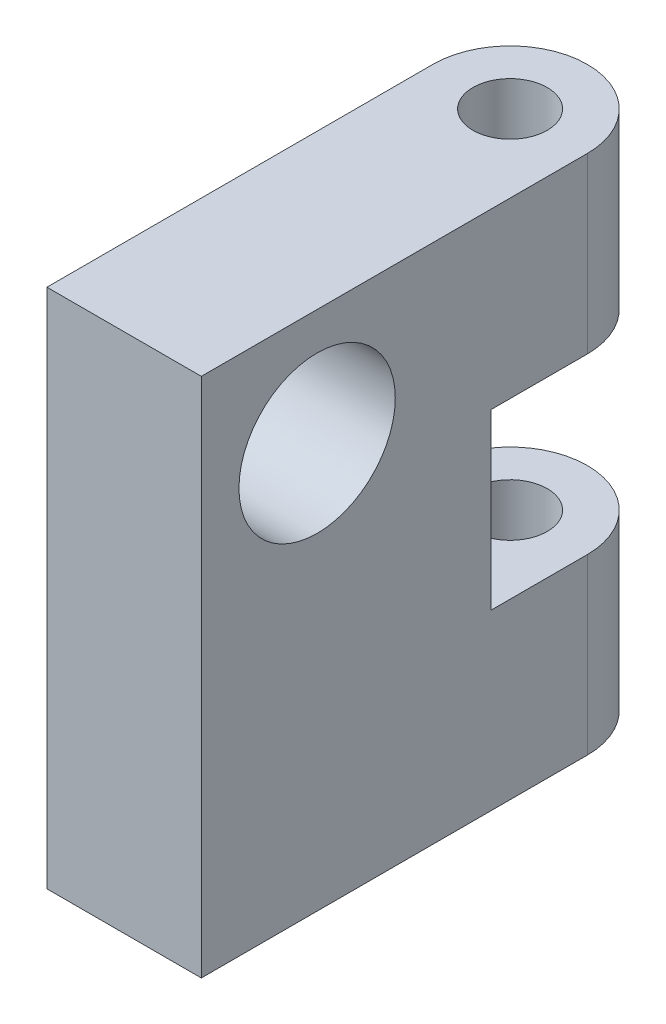
ISO-10303-21;
HEADER;
FILE_DESCRIPTION(('STEP AP214'),'2;1');
FILE_NAME('part.step','',(''),(''),'','','');
FILE_SCHEMA(('AUTOMOTIVE_DESIGN { 1 0 10303 214 1 1 1 1 }'));
ENDSEC;
DATA;
#1=APPLICATION_CONTEXT('core data for automotive mechanical design processes');
#2=APPLICATION_PROTOCOL_DEFINITION('international standard','automotive_design',2000,#1);
#3=PRODUCT_CONTEXT('',#1,'mechanical');
#4=PRODUCT('Part','Part','',(#3));
#5=PRODUCT_RELATED_PRODUCT_CATEGORY('part','',(#4));
#6=PRODUCT_DEFINITION_FORMATION('','',#4);
#7=PRODUCT_DEFINITION_CONTEXT('part definition',#1,'design');
#8=PRODUCT_DEFINITION('design','',#6,#7);
#9=PRODUCT_DEFINITION_SHAPE('','',#8);
#10=(LENGTH_UNIT() NAMED_UNIT(*) SI_UNIT(.MILLI.,.METRE.));
#11=(NAMED_UNIT(*) PLANE_ANGLE_UNIT() SI_UNIT($,.RADIAN.));
#12=(NAMED_UNIT(*) SI_UNIT($,.STERADIAN.) SOLID_ANGLE_UNIT());
#13=UNCERTAINTY_MEASURE_WITH_UNIT(LENGTH_MEASURE(1.E-05),#10,'distance_accuracy_value','');
#14=(GEOMETRIC_REPRESENTATION_CONTEXT(3) GLOBAL_UNCERTAINTY_ASSIGNED_CONTEXT((#13)) GLOBAL_UNIT_ASSIGNED_CONTEXT((#10,
#11,#12)) REPRESENTATION_CONTEXT('',''));
#15=CARTESIAN_POINT('',(0.,0.,0.));
#16=DIRECTION('',(0.,0.,1.));
#17=DIRECTION('',(1.,0.,0.));
#18=AXIS2_PLACEMENT_3D('',#15,#16,#17);
#19=CARTESIAN_POINT('',(0.,27.,0.));
#20=DIRECTION('',(0.,-1.,0.));
#21=DIRECTION('',(0.,0.,-1.));
#22=AXIS2_PLACEMENT_3D('',#19,#20,#21);
#23=CYLINDRICAL_SURFACE('',#22,4.);
#24=CARTESIAN_POINT('',(0.,9.,0.));
#25=DIRECTION('',(0.,-1.,0.));
#26=DIRECTION('',(0.,0.,-1.));
#27=AXIS2_PLACEMENT_3D('',#24,#25,#26);
#28=CIRCLE('',#27,4.);
#29=CARTESIAN_POINT('',(-4.,9.,0.));
#30=VERTEX_POINT('',#29);
#31=CARTESIAN_POINT('',(4.,9.,0.));
#32=VERTEX_POINT('',#31);
#33=EDGE_CURVE('E124',#30,#32,#28,.T.);
#34=ORIENTED_EDGE('',*,*,#33,.T.);
#35=DIRECTION('',(0.,-1.,0.));
#36=VECTOR('',#35,1.);
#37=CARTESIAN_POINT('',(4.,27.,0.));
#38=LINE('',#37,#36);
#39=CARTESIAN_POINT('',(4.,0.,0.));
#40=VERTEX_POINT('',#39);
#41=EDGE_CURVE('E44',#32,#40,#38,.T.);
#42=ORIENTED_EDGE('',*,*,#41,.T.);
#43=CARTESIAN_POINT('',(0.,0.,0.));
#44=DIRECTION('',(0.,1.,0.));
#45=DIRECTION('',(0.,0.,1.));
#46=AXIS2_PLACEMENT_3D('',#43,#44,#45);
#47=CIRCLE('',#46,4.);
#48=CARTESIAN_POINT('',(-4.,0.,0.));
#49=VERTEX_POINT('',#48);
#50=EDGE_CURVE('E168',#40,#49,#47,.T.);
#51=ORIENTED_EDGE('',*,*,#50,.T.);
#52=DIRECTION('',(0.,-1.,0.));
#53=VECTOR('',#52,1.);
#54=CARTESIAN_POINT('',(-4.,27.,0.));
#55=LINE('',#54,#53);
#56=EDGE_CURVE('E181',#30,#49,#55,.T.);
#57=ORIENTED_EDGE('',*,*,#56,.F.);
#58=EDGE_LOOP('',(#34,#42,#51,#57));
#59=FACE_BOUND('',#58,.T.);
#60=ADVANCED_FACE('F35',(#59),#23,.T.);
#61=CARTESIAN_POINT('',(0.,27.,0.));
#62=DIRECTION('',(0.,-1.,0.));
#63=DIRECTION('',(0.,0.,-1.));
#64=AXIS2_PLACEMENT_3D('',#61,#62,#63);
#65=CYLINDRICAL_SURFACE('',#64,1.925);
#66=CARTESIAN_POINT('',(0.,9.,0.));
#67=DIRECTION('',(0.,-1.,0.));
#68=DIRECTION('',(0.,0.,-1.));
#69=AXIS2_PLACEMENT_3D('',#66,#67,#68);
#70=CIRCLE('',#69,1.925);
#71=CARTESIAN_POINT('',(0.,9.,-1.925));
#72=VERTEX_POINT('',#71);
#73=EDGE_CURVE('E39',#72,#72,#70,.T.);
#74=ORIENTED_EDGE('',*,*,#73,.F.);
#75=EDGE_LOOP('',(#74));
#76=FACE_BOUND('',#75,.T.);
#77=CARTESIAN_POINT('',(0.,0.,0.));
#78=DIRECTION('',(0.,1.,0.));
#79=DIRECTION('',(0.,0.,1.));
#80=AXIS2_PLACEMENT_3D('',#77,#78,#79);
#81=CIRCLE('',#80,1.925);
#82=CARTESIAN_POINT('',(0.,0.,1.925));
#83=VERTEX_POINT('',#82);
#84=EDGE_CURVE('E157',#83,#83,#81,.T.);
#85=ORIENTED_EDGE('',*,*,#84,.F.);
#86=EDGE_LOOP('',(#85));
#87=FACE_BOUND('',#86,.T.);
#88=ADVANCED_FACE('F196',(#76,#87),#65,.F.);
#89=CARTESIAN_POINT('',(4.,27.,0.));
#90=DIRECTION('',(1.,0.,0.));
#91=DIRECTION('',(0.,0.,-1.));
#92=AXIS2_PLACEMENT_3D('',#89,#90,#91);
#93=PLANE('',#92);
#94=DIRECTION('',(0.,0.,-1.));
#95=VECTOR('',#94,1.);
#96=CARTESIAN_POINT('',(4.,9.,0.));
#97=LINE('',#96,#95);
#98=CARTESIAN_POINT('',(4.,9.,5.));
#99=VERTEX_POINT('',#98);
#100=EDGE_CURVE('E147',#99,#32,#97,.T.);
#101=ORIENTED_EDGE('',*,*,#100,.F.);
#102=DIRECTION('',(0.,-1.,0.));
#103=VECTOR('',#102,1.);
#104=CARTESIAN_POINT('',(4.,27.,5.));
#105=LINE('',#104,#103);
#106=CARTESIAN_POINT('',(4.,18.,5.));
#107=VERTEX_POINT('',#106);
#108=EDGE_CURVE('E113',#107,#99,#105,.T.);
#109=ORIENTED_EDGE('',*,*,#108,.F.);
#110=DIRECTION('',(0.,0.,1.));
#111=VECTOR('',#110,1.);
#112=CARTESIAN_POINT('',(4.,18.,0.));
#113=LINE('',#112,#111);
#114=CARTESIAN_POINT('',(4.,18.,0.));
#115=VERTEX_POINT('',#114);
#116=EDGE_CURVE('E144',#115,#107,#113,.T.);
#117=ORIENTED_EDGE('',*,*,#116,.F.);
#118=CARTESIAN_POINT('',(4.,27.,0.));
#119=VERTEX_POINT('',#118);
#120=EDGE_CURVE('E11',#119,#115,#38,.T.);
#121=ORIENTED_EDGE('',*,*,#120,.F.);
#122=DIRECTION('',(0.,0.,1.));
#123=VECTOR('',#122,1.);
#124=CARTESIAN_POINT('',(4.,27.,0.));
#125=LINE('',#124,#123);
#126=CARTESIAN_POINT('',(4.,27.,20.));
#127=VERTEX_POINT('',#126);
#128=EDGE_CURVE('E154',#119,#127,#125,.T.);
#129=ORIENTED_EDGE('',*,*,#128,.T.);
#130=DIRECTION('',(0.,-1.,0.));
#131=VECTOR('',#130,1.);
#132=CARTESIAN_POINT('',(4.,27.,20.));
#133=LINE('',#132,#131);
#134=CARTESIAN_POINT('',(4.,0.,20.));
#135=VERTEX_POINT('',#134);
#136=EDGE_CURVE('E82',#127,#135,#133,.T.);
#137=ORIENTED_EDGE('',*,*,#136,.T.);
#138=DIRECTION('',(0.,0.,1.));
#139=VECTOR('',#138,1.);
#140=CARTESIAN_POINT('',(4.,0.,0.));
#141=LINE('',#140,#139);
#142=EDGE_CURVE('E165',#40,#135,#141,.T.);
#143=ORIENTED_EDGE('',*,*,#142,.F.);
#144=ORIENTED_EDGE('',*,*,#41,.F.);
#145=EDGE_LOOP('',(#101,#109,#117,#121,#129,#137,#143,#144));
#146=FACE_BOUND('',#145,.T.);
#147=CARTESIAN_POINT('',(4.,21.,14.));
#148=DIRECTION('',(1.,0.,0.));
#149=DIRECTION('',(0.,0.,-1.));
#150=AXIS2_PLACEMENT_3D('',#147,#148,#149);
#151=CIRCLE('',#150,4.05);
#152=CARTESIAN_POINT('',(4.,21.,9.95));
#153=VERTEX_POINT('',#152);
#154=EDGE_CURVE('E150',#153,#153,#151,.T.);
#155=ORIENTED_EDGE('',*,*,#154,.F.);
#156=EDGE_LOOP('',(#155));
#157=FACE_BOUND('',#156,.T.);
#158=ADVANCED_FACE('F37',(#146,#157),#93,.T.);
#159=CARTESIAN_POINT('',(0.,18.,0.));
#160=DIRECTION('',(0.,1.,0.));
#161=DIRECTION('',(0.,0.,1.));
#162=AXIS2_PLACEMENT_3D('',#159,#160,#161);
#163=CIRCLE('',#162,4.);
#164=CARTESIAN_POINT('',(-4.,18.,0.));
#165=VERTEX_POINT('',#164);
#166=EDGE_CURVE('E142',#115,#165,#163,.T.);
#167=ORIENTED_EDGE('',*,*,#166,.T.);
#168=CARTESIAN_POINT('',(-4.,27.,0.));
#169=VERTEX_POINT('',#168);
#170=EDGE_CURVE('E182',#169,#165,#55,.T.);
#171=ORIENTED_EDGE('',*,*,#170,.F.);
#172=CARTESIAN_POINT('',(0.,27.,0.));
#173=DIRECTION('',(0.,1.,0.));
#174=DIRECTION('',(0.,0.,1.));
#175=AXIS2_PLACEMENT_3D('',#172,#173,#174);
#176=CIRCLE('',#175,4.);
#177=EDGE_CURVE('E156',#119,#169,#176,.T.);
#178=ORIENTED_EDGE('',*,*,#177,.F.);
#179=ORIENTED_EDGE('',*,*,#120,.T.);
#180=EDGE_LOOP('',(#167,#171,#178,#179));
#181=FACE_BOUND('',#180,.T.);
#182=ADVANCED_FACE('F211',(#181),#23,.T.);
#183=CARTESIAN_POINT('',(-4.,27.,0.));
#184=DIRECTION('',(1.,0.,0.));
#185=DIRECTION('',(0.,0.,-1.));
#186=AXIS2_PLACEMENT_3D('',#183,#184,#185);
#187=PLANE('',#186);
#188=CARTESIAN_POINT('',(-4.,21.,14.));
#189=DIRECTION('',(1.,0.,0.));
#190=DIRECTION('',(0.,0.,-1.));
#191=AXIS2_PLACEMENT_3D('',#188,#189,#190);
#192=CIRCLE('',#191,4.05);
#193=CARTESIAN_POINT('',(-4.,21.,9.95));
#194=VERTEX_POINT('',#193);
#195=EDGE_CURVE('E153',#194,#194,#192,.T.);
#196=ORIENTED_EDGE('',*,*,#195,.T.);
#197=EDGE_LOOP('',(#196));
#198=FACE_BOUND('',#197,.T.);
#199=DIRECTION('',(0.,1.,0.));
#200=VECTOR('',#199,1.);
#201=CARTESIAN_POINT('',(-4.,18.,5.));
#202=LINE('',#201,#200);
#203=CARTESIAN_POINT('',(-4.,9.,5.));
#204=VERTEX_POINT('',#203);
#205=CARTESIAN_POINT('',(-4.,18.,5.));
#206=VERTEX_POINT('',#205);
#207=EDGE_CURVE('E52',#204,#206,#202,.T.);
#208=ORIENTED_EDGE('',*,*,#207,.F.);
#209=DIRECTION('',(0.,0.,1.));
#210=VECTOR('',#209,1.);
#211=CARTESIAN_POINT('',(-4.,9.,5.));
#212=LINE('',#211,#210);
#213=EDGE_CURVE('E121',#30,#204,#212,.T.);
#214=ORIENTED_EDGE('',*,*,#213,.F.);
#215=ORIENTED_EDGE('',*,*,#56,.T.);
#216=DIRECTION('',(0.,0.,1.));
#217=VECTOR('',#216,1.);
#218=CARTESIAN_POINT('',(-4.,0.,0.));
#219=LINE('',#218,#217);
#220=CARTESIAN_POINT('',(-4.,0.,20.));
#221=VERTEX_POINT('',#220);
#222=EDGE_CURVE('E171',#49,#221,#219,.T.);
#223=ORIENTED_EDGE('',*,*,#222,.T.);
#224=DIRECTION('',(0.,-1.,0.));
#225=VECTOR('',#224,1.);
#226=CARTESIAN_POINT('',(-4.,27.,20.));
#227=LINE('',#226,#225);
#228=CARTESIAN_POINT('',(-4.,27.,20.));
#229=VERTEX_POINT('',#228);
#230=EDGE_CURVE('E178',#229,#221,#227,.T.);
#231=ORIENTED_EDGE('',*,*,#230,.F.);
#232=DIRECTION('',(0.,0.,1.));
#233=VECTOR('',#232,1.);
#234=CARTESIAN_POINT('',(-4.,27.,0.));
#235=LINE('',#234,#233);
#236=EDGE_CURVE('E159',#169,#229,#235,.T.);
#237=ORIENTED_EDGE('',*,*,#236,.F.);
#238=ORIENTED_EDGE('',*,*,#170,.T.);
#239=DIRECTION('',(0.,0.,-1.));
#240=VECTOR('',#239,1.);
#241=CARTESIAN_POINT('',(-4.,18.,5.));
#242=LINE('',#241,#240);
#243=EDGE_CURVE('E127',#206,#165,#242,.T.);
#244=ORIENTED_EDGE('',*,*,#243,.F.);
#245=EDGE_LOOP('',(#208,#214,#215,#223,#231,#237,#238,#244));
#246=FACE_BOUND('',#245,.T.);
#247=ADVANCED_FACE('F130',(#198,#246),#187,.F.);
#248=CARTESIAN_POINT('',(0.,27.,20.));
#249=DIRECTION('',(0.,0.,-1.));
#250=DIRECTION('',(-1.,0.,0.));
#251=AXIS2_PLACEMENT_3D('',#248,#249,#250);
#252=PLANE('',#251);
#253=DIRECTION('',(1.,0.,0.));
#254=VECTOR('',#253,1.);
#255=CARTESIAN_POINT('',(0.,0.,20.));
#256=LINE('',#255,#254);
#257=EDGE_CURVE('E173',#221,#135,#256,.T.);
#258=ORIENTED_EDGE('',*,*,#257,.T.);
#259=ORIENTED_EDGE('',*,*,#136,.F.);
#260=DIRECTION('',(1.,0.,0.));
#261=VECTOR('',#260,1.);
#262=CARTESIAN_POINT('',(0.,27.,20.));
#263=LINE('',#262,#261);
#264=EDGE_CURVE('E61',#229,#127,#263,.T.);
#265=ORIENTED_EDGE('',*,*,#264,.F.);
#266=ORIENTED_EDGE('',*,*,#230,.T.);
#267=EDGE_LOOP('',(#258,#259,#265,#266));
#268=FACE_BOUND('',#267,.T.);
#269=ADVANCED_FACE('F194',(#268),#252,.F.);
#270=CARTESIAN_POINT('',(0.,18.,0.));
#271=DIRECTION('',(0.,1.,0.));
#272=DIRECTION('',(0.,0.,1.));
#273=AXIS2_PLACEMENT_3D('',#270,#271,#272);
#274=CIRCLE('',#273,1.925);
#275=CARTESIAN_POINT('',(0.,18.,1.925));
#276=VERTEX_POINT('',#275);
#277=EDGE_CURVE('E117',#276,#276,#274,.T.);
#278=ORIENTED_EDGE('',*,*,#277,.F.);
#279=EDGE_LOOP('',(#278));
#280=FACE_BOUND('',#279,.T.);
#281=CARTESIAN_POINT('',(0.,27.,0.));
#282=DIRECTION('',(0.,1.,0.));
#283=DIRECTION('',(0.,0.,1.));
#284=AXIS2_PLACEMENT_3D('',#281,#282,#283);
#285=CIRCLE('',#284,1.925);
#286=CARTESIAN_POINT('',(0.,27.,1.925));
#287=VERTEX_POINT('',#286);
#288=EDGE_CURVE('E162',#287,#287,#285,.T.);
#289=ORIENTED_EDGE('',*,*,#288,.T.);
#290=EDGE_LOOP('',(#289));
#291=FACE_BOUND('',#290,.T.);
#292=ADVANCED_FACE('F190',(#280,#291),#65,.F.);
#293=CARTESIAN_POINT('',(0.,27.,0.));
#294=DIRECTION('',(0.,1.,0.));
#295=DIRECTION('',(0.,0.,1.));
#296=AXIS2_PLACEMENT_3D('',#293,#294,#295);
#297=PLANE('',#296);
#298=ORIENTED_EDGE('',*,*,#128,.F.);
#299=ORIENTED_EDGE('',*,*,#177,.T.);
#300=ORIENTED_EDGE('',*,*,#236,.T.);
#301=ORIENTED_EDGE('',*,*,#264,.T.);
#302=EDGE_LOOP('',(#298,#299,#300,#301));
#303=FACE_BOUND('',#302,.T.);
#304=ORIENTED_EDGE('',*,*,#288,.F.);
#305=EDGE_LOOP('',(#304));
#306=FACE_BOUND('',#305,.T.);
#307=ADVANCED_FACE('F193',(#303,#306),#297,.T.);
#308=CARTESIAN_POINT('',(0.,0.,0.));
#309=DIRECTION('',(0.,1.,0.));
#310=DIRECTION('',(0.,0.,1.));
#311=AXIS2_PLACEMENT_3D('',#308,#309,#310);
#312=PLANE('',#311);
#313=CARTESIAN_POINT('',(0.,0.,15.));
#314=DIRECTION('',(0.,-1.,0.));
#315=DIRECTION('',(0.,0.,-1.));
#316=AXIS2_PLACEMENT_3D('',#313,#314,#315);
#317=CIRCLE('',#316,1.825);
#318=CARTESIAN_POINT('',(0.,0.,13.175));
#319=VERTEX_POINT('',#318);
#320=EDGE_CURVE('E137',#319,#319,#317,.T.);
#321=ORIENTED_EDGE('',*,*,#320,.F.);
#322=EDGE_LOOP('',(#321));
#323=FACE_BOUND('',#322,.T.);
#324=ORIENTED_EDGE('',*,*,#142,.T.);
#325=ORIENTED_EDGE('',*,*,#257,.F.);
#326=ORIENTED_EDGE('',*,*,#222,.F.);
#327=ORIENTED_EDGE('',*,*,#50,.F.);
#328=EDGE_LOOP('',(#324,#325,#326,#327));
#329=FACE_BOUND('',#328,.T.);
#330=ORIENTED_EDGE('',*,*,#84,.T.);
#331=EDGE_LOOP('',(#330));
#332=FACE_BOUND('',#331,.T.);
#333=ADVANCED_FACE('F200',(#323,#329,#332),#312,.F.);
#334=CARTESIAN_POINT('',(-21.,21.,14.));
#335=DIRECTION('',(1.,0.,0.));
#336=DIRECTION('',(0.,0.,-1.));
#337=AXIS2_PLACEMENT_3D('',#334,#335,#336);
#338=CYLINDRICAL_SURFACE('',#337,4.05);
#339=ORIENTED_EDGE('',*,*,#154,.T.);
#340=EDGE_LOOP('',(#339));
#341=FACE_BOUND('',#340,.T.);
#342=ORIENTED_EDGE('',*,*,#195,.F.);
#343=EDGE_LOOP('',(#342));
#344=FACE_BOUND('',#343,.T.);
#345=ADVANCED_FACE('F205',(#341,#344),#338,.F.);
#346=CARTESIAN_POINT('',(21.,9.,5.));
#347=DIRECTION('',(0.,-1.,0.));
#348=DIRECTION('',(0.,0.,-1.));
#349=AXIS2_PLACEMENT_3D('',#346,#347,#348);
#350=PLANE('',#349);
#351=ORIENTED_EDGE('',*,*,#100,.T.);
#352=ORIENTED_EDGE('',*,*,#33,.F.);
#353=ORIENTED_EDGE('',*,*,#213,.T.);
#354=DIRECTION('',(-1.,0.,0.));
#355=VECTOR('',#354,1.);
#356=CARTESIAN_POINT('',(21.,9.,5.));
#357=LINE('',#356,#355);
#358=EDGE_CURVE('E109',#99,#204,#357,.T.);
#359=ORIENTED_EDGE('',*,*,#358,.F.);
#360=EDGE_LOOP('',(#351,#352,#353,#359));
#361=FACE_BOUND('',#360,.T.);
#362=ORIENTED_EDGE('',*,*,#73,.T.);
#363=EDGE_LOOP('',(#362));
#364=FACE_BOUND('',#363,.T.);
#365=ADVANCED_FACE('F122',(#361,#364),#350,.F.);
#366=CARTESIAN_POINT('',(21.,18.,5.));
#367=DIRECTION('',(0.,1.,0.));
#368=DIRECTION('',(0.,0.,1.));
#369=AXIS2_PLACEMENT_3D('',#366,#367,#368);
#370=PLANE('',#369);
#371=ORIENTED_EDGE('',*,*,#116,.T.);
#372=DIRECTION('',(-1.,0.,0.));
#373=VECTOR('',#372,1.);
#374=CARTESIAN_POINT('',(21.,18.,5.));
#375=LINE('',#374,#373);
#376=EDGE_CURVE('E118',#107,#206,#375,.T.);
#377=ORIENTED_EDGE('',*,*,#376,.T.);
#378=ORIENTED_EDGE('',*,*,#243,.T.);
#379=ORIENTED_EDGE('',*,*,#166,.F.);
#380=EDGE_LOOP('',(#371,#377,#378,#379));
#381=FACE_BOUND('',#380,.T.);
#382=ORIENTED_EDGE('',*,*,#277,.T.);
#383=EDGE_LOOP('',(#382));
#384=FACE_BOUND('',#383,.T.);
#385=ADVANCED_FACE('F188',(#381,#384),#370,.F.);
#386=CARTESIAN_POINT('',(21.,18.,5.));
#387=DIRECTION('',(0.,0.,1.));
#388=DIRECTION('',(1.,0.,0.));
#389=AXIS2_PLACEMENT_3D('',#386,#387,#388);
#390=PLANE('',#389);
#391=ORIENTED_EDGE('',*,*,#108,.T.);
#392=ORIENTED_EDGE('',*,*,#358,.T.);
#393=ORIENTED_EDGE('',*,*,#207,.T.);
#394=ORIENTED_EDGE('',*,*,#376,.F.);
#395=EDGE_LOOP('',(#391,#392,#393,#394));
#396=FACE_BOUND('',#395,.T.);
#397=ADVANCED_FACE('F111',(#396),#390,.F.);
#398=CARTESIAN_POINT('',(0.,5.,15.));
#399=DIRECTION('',(0.,-1.,0.));
#400=DIRECTION('',(0.,0.,-1.));
#401=AXIS2_PLACEMENT_3D('',#398,#399,#400);
#402=CYLINDRICAL_SURFACE('',#401,1.825);
#403=CARTESIAN_POINT('',(0.,5.,15.));
#404=DIRECTION('',(0.,-1.,0.));
#405=DIRECTION('',(0.,0.,-1.));
#406=AXIS2_PLACEMENT_3D('',#403,#404,#405);
#407=CIRCLE('',#406,1.825);
#408=CARTESIAN_POINT('',(0.,5.,13.175));
#409=VERTEX_POINT('',#408);
#410=EDGE_CURVE('E133',#409,#409,#407,.T.);
#411=ORIENTED_EDGE('',*,*,#410,.F.);
#412=EDGE_LOOP('',(#411));
#413=FACE_BOUND('',#412,.T.);
#414=ORIENTED_EDGE('',*,*,#320,.T.);
#415=EDGE_LOOP('',(#414));
#416=FACE_BOUND('',#415,.T.);
#417=ADVANCED_FACE('F242',(#413,#416),#402,.F.);
#418=CARTESIAN_POINT('',(0.,5.,15.));
#419=DIRECTION('',(0.,-1.,0.));
#420=DIRECTION('',(0.,0.,-1.));
#421=AXIS2_PLACEMENT_3D('',#418,#419,#420);
#422=PLANE('',#421);
#423=ORIENTED_EDGE('',*,*,#410,.T.);
#424=EDGE_LOOP('',(#423));
#425=FACE_BOUND('',#424,.T.);
#426=ADVANCED_FACE('F247',(#425),#422,.T.);
#427=CLOSED_SHELL('',(#60,#88,#158,#182,#247,#269,#292,#307,#333,#345,#365,#385,#397,#417,#426));
#428=MANIFOLD_SOLID_BREP('B2',#427);
#429=ADVANCED_BREP_SHAPE_REPRESENTATION('',(#18,#428),#14);
#430=SHAPE_DEFINITION_REPRESENTATION(#9,#429);
ENDSEC;
END-ISO-10303-21;
